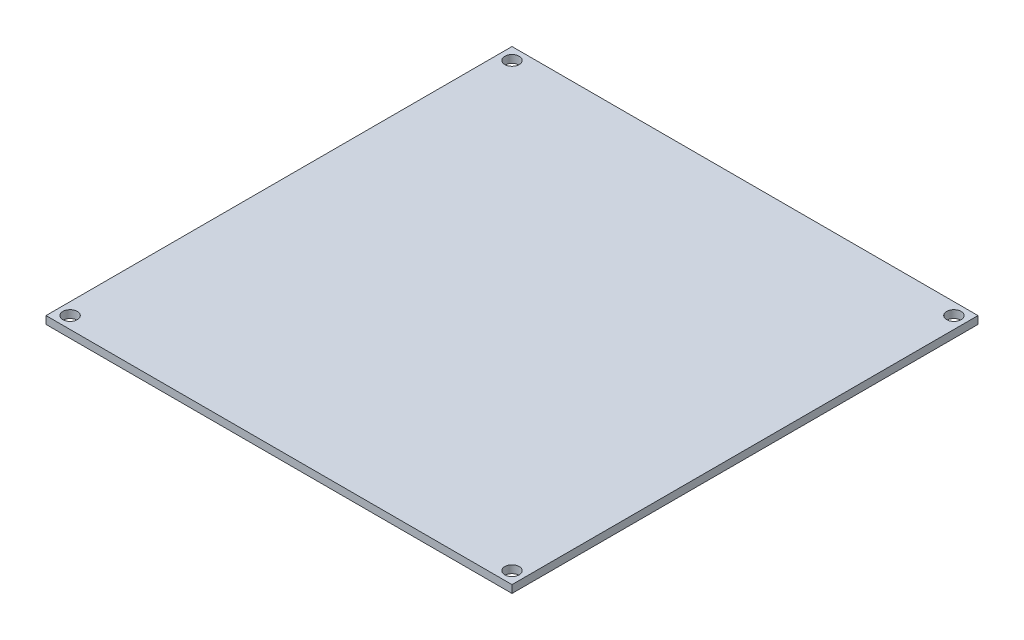
ISO-10303-21;
HEADER;
FILE_DESCRIPTION(('STEP AP214'),'2;1');
FILE_NAME('part.step','',(''),(''),'','','');
FILE_SCHEMA(('AUTOMOTIVE_DESIGN { 1 0 10303 214 1 1 1 1 }'));
ENDSEC;
DATA;
#1=APPLICATION_CONTEXT('core data for automotive mechanical design processes');
#2=APPLICATION_PROTOCOL_DEFINITION('international standard','automotive_design',2000,#1);
#3=PRODUCT_CONTEXT('',#1,'mechanical');
#4=PRODUCT('Part','Part','',(#3));
#5=PRODUCT_RELATED_PRODUCT_CATEGORY('part','',(#4));
#6=PRODUCT_DEFINITION_FORMATION('','',#4);
#7=PRODUCT_DEFINITION_CONTEXT('part definition',#1,'design');
#8=PRODUCT_DEFINITION('design','',#6,#7);
#9=PRODUCT_DEFINITION_SHAPE('','',#8);
#10=(LENGTH_UNIT() NAMED_UNIT(*) SI_UNIT(.MILLI.,.METRE.));
#11=(NAMED_UNIT(*) PLANE_ANGLE_UNIT() SI_UNIT($,.RADIAN.));
#12=(NAMED_UNIT(*) SI_UNIT($,.STERADIAN.) SOLID_ANGLE_UNIT());
#13=UNCERTAINTY_MEASURE_WITH_UNIT(LENGTH_MEASURE(1.E-05),#10,'distance_accuracy_value','');
#14=(GEOMETRIC_REPRESENTATION_CONTEXT(3) GLOBAL_UNCERTAINTY_ASSIGNED_CONTEXT((#13)) GLOBAL_UNIT_ASSIGNED_CONTEXT((#10,
#11,#12)) REPRESENTATION_CONTEXT('',''));
#15=CARTESIAN_POINT('',(0.,0.,0.));
#16=DIRECTION('',(0.,0.,1.));
#17=DIRECTION('',(1.,0.,0.));
#18=AXIS2_PLACEMENT_3D('',#15,#16,#17);
#19=CARTESIAN_POINT('',(0.,1.6,0.));
#20=DIRECTION('',(0.,-1.,0.));
#21=DIRECTION('',(0.,0.,-1.));
#22=AXIS2_PLACEMENT_3D('',#19,#20,#21);
#23=PLANE('',#22);
#24=DIRECTION('',(0.,0.,-1.));
#25=VECTOR('',#24,1.);
#26=CARTESIAN_POINT('',(48.4,1.6,48.4));
#27=LINE('',#26,#25);
#28=CARTESIAN_POINT('',(48.4,1.6,48.4));
#29=VERTEX_POINT('',#28);
#30=CARTESIAN_POINT('',(48.4,1.6,-48.4));
#31=VERTEX_POINT('',#30);
#32=EDGE_CURVE('E87',#29,#31,#27,.T.);
#33=ORIENTED_EDGE('',*,*,#32,.T.);
#34=DIRECTION('',(-1.,0.,0.));
#35=VECTOR('',#34,1.);
#36=CARTESIAN_POINT('',(-48.4,1.6,-48.4));
#37=LINE('',#36,#35);
#38=CARTESIAN_POINT('',(-48.4,1.6,-48.4));
#39=VERTEX_POINT('',#38);
#40=EDGE_CURVE('E82',#31,#39,#37,.T.);
#41=ORIENTED_EDGE('',*,*,#40,.T.);
#42=DIRECTION('',(0.,0.,1.));
#43=VECTOR('',#42,1.);
#44=CARTESIAN_POINT('',(-48.4,1.6,48.4));
#45=LINE('',#44,#43);
#46=CARTESIAN_POINT('',(-48.4,1.6,48.4));
#47=VERTEX_POINT('',#46);
#48=EDGE_CURVE('E85',#39,#47,#45,.T.);
#49=ORIENTED_EDGE('',*,*,#48,.T.);
#50=DIRECTION('',(1.,0.,0.));
#51=VECTOR('',#50,1.);
#52=CARTESIAN_POINT('',(-48.4,1.6,48.4));
#53=LINE('',#52,#51);
#54=EDGE_CURVE('E52',#47,#29,#53,.T.);
#55=ORIENTED_EDGE('',*,*,#54,.T.);
#56=EDGE_LOOP('',(#33,#41,#49,#55));
#57=FACE_BOUND('',#56,.T.);
#58=CARTESIAN_POINT('',(-45.9,1.6,-45.9));
#59=DIRECTION('',(0.,1.,0.));
#60=DIRECTION('',(0.,0.,1.));
#61=AXIS2_PLACEMENT_3D('',#58,#59,#60);
#62=CIRCLE('',#61,1.5);
#63=CARTESIAN_POINT('',(-45.9,1.6,-44.4));
#64=VERTEX_POINT('',#63);
#65=EDGE_CURVE('E102',#64,#64,#62,.T.);
#66=ORIENTED_EDGE('',*,*,#65,.F.);
#67=EDGE_LOOP('',(#66));
#68=FACE_BOUND('',#67,.T.);
#69=CARTESIAN_POINT('',(-45.9,1.6,45.9));
#70=DIRECTION('',(0.,1.,0.));
#71=DIRECTION('',(0.,0.,-1.));
#72=AXIS2_PLACEMENT_3D('',#69,#70,#71);
#73=CIRCLE('',#72,1.5);
#74=CARTESIAN_POINT('',(-45.9,1.6,44.4));
#75=VERTEX_POINT('',#74);
#76=EDGE_CURVE('E117',#75,#75,#73,.T.);
#77=ORIENTED_EDGE('',*,*,#76,.F.);
#78=EDGE_LOOP('',(#77));
#79=FACE_BOUND('',#78,.T.);
#80=CARTESIAN_POINT('',(45.9,1.6,45.9));
#81=DIRECTION('',(0.,1.,0.));
#82=DIRECTION('',(0.,0.,1.));
#83=AXIS2_PLACEMENT_3D('',#80,#81,#82);
#84=CIRCLE('',#83,1.5);
#85=CARTESIAN_POINT('',(45.9,1.6,47.4));
#86=VERTEX_POINT('',#85);
#87=EDGE_CURVE('E123',#86,#86,#84,.T.);
#88=ORIENTED_EDGE('',*,*,#87,.F.);
#89=EDGE_LOOP('',(#88));
#90=FACE_BOUND('',#89,.T.);
#91=CARTESIAN_POINT('',(45.9,1.6,-45.9));
#92=DIRECTION('',(0.,1.,0.));
#93=DIRECTION('',(0.,0.,-1.));
#94=AXIS2_PLACEMENT_3D('',#91,#92,#93);
#95=CIRCLE('',#94,1.5);
#96=CARTESIAN_POINT('',(45.9,1.6,-47.4));
#97=VERTEX_POINT('',#96);
#98=EDGE_CURVE('E129',#97,#97,#95,.T.);
#99=ORIENTED_EDGE('',*,*,#98,.F.);
#100=EDGE_LOOP('',(#99));
#101=FACE_BOUND('',#100,.T.);
#102=ADVANCED_FACE('F35',(#57,#68,#79,#90,#101),#23,.F.);
#103=CARTESIAN_POINT('',(0.,0.,0.));
#104=DIRECTION('',(0.,-1.,0.));
#105=DIRECTION('',(0.,0.,-1.));
#106=AXIS2_PLACEMENT_3D('',#103,#104,#105);
#107=PLANE('',#106);
#108=CARTESIAN_POINT('',(45.9,0.,45.9));
#109=DIRECTION('',(0.,1.,0.));
#110=DIRECTION('',(0.,0.,1.));
#111=AXIS2_PLACEMENT_3D('',#108,#109,#110);
#112=CIRCLE('',#111,1.5);
#113=CARTESIAN_POINT('',(45.9,0.,47.4));
#114=VERTEX_POINT('',#113);
#115=EDGE_CURVE('E126',#114,#114,#112,.T.);
#116=ORIENTED_EDGE('',*,*,#115,.T.);
#117=EDGE_LOOP('',(#116));
#118=FACE_BOUND('',#117,.T.);
#119=CARTESIAN_POINT('',(-45.9,0.,-45.9));
#120=DIRECTION('',(0.,1.,0.));
#121=DIRECTION('',(0.,0.,1.));
#122=AXIS2_PLACEMENT_3D('',#119,#120,#121);
#123=CIRCLE('',#122,1.5);
#124=CARTESIAN_POINT('',(-45.9,0.,-44.4));
#125=VERTEX_POINT('',#124);
#126=EDGE_CURVE('E114',#125,#125,#123,.T.);
#127=ORIENTED_EDGE('',*,*,#126,.T.);
#128=EDGE_LOOP('',(#127));
#129=FACE_BOUND('',#128,.T.);
#130=DIRECTION('',(0.,0.,-1.));
#131=VECTOR('',#130,1.);
#132=CARTESIAN_POINT('',(48.4,0.,48.4));
#133=LINE('',#132,#131);
#134=CARTESIAN_POINT('',(48.4,0.,48.4));
#135=VERTEX_POINT('',#134);
#136=CARTESIAN_POINT('',(48.4,0.,-48.4));
#137=VERTEX_POINT('',#136);
#138=EDGE_CURVE('E99',#135,#137,#133,.T.);
#139=ORIENTED_EDGE('',*,*,#138,.F.);
#140=DIRECTION('',(1.,0.,0.));
#141=VECTOR('',#140,1.);
#142=CARTESIAN_POINT('',(-48.4,0.,48.4));
#143=LINE('',#142,#141);
#144=CARTESIAN_POINT('',(-48.4,0.,48.4));
#145=VERTEX_POINT('',#144);
#146=EDGE_CURVE('E75',#145,#135,#143,.T.);
#147=ORIENTED_EDGE('',*,*,#146,.F.);
#148=DIRECTION('',(0.,0.,1.));
#149=VECTOR('',#148,1.);
#150=CARTESIAN_POINT('',(-48.4,0.,48.4));
#151=LINE('',#150,#149);
#152=CARTESIAN_POINT('',(-48.4,0.,-48.4));
#153=VERTEX_POINT('',#152);
#154=EDGE_CURVE('E69',#153,#145,#151,.T.);
#155=ORIENTED_EDGE('',*,*,#154,.F.);
#156=DIRECTION('',(-1.,0.,0.));
#157=VECTOR('',#156,1.);
#158=CARTESIAN_POINT('',(-48.4,0.,-48.4));
#159=LINE('',#158,#157);
#160=EDGE_CURVE('E91',#137,#153,#159,.T.);
#161=ORIENTED_EDGE('',*,*,#160,.F.);
#162=EDGE_LOOP('',(#139,#147,#155,#161));
#163=FACE_BOUND('',#162,.T.);
#164=CARTESIAN_POINT('',(-45.9,0.,45.9));
#165=DIRECTION('',(0.,1.,0.));
#166=DIRECTION('',(0.,0.,-1.));
#167=AXIS2_PLACEMENT_3D('',#164,#165,#166);
#168=CIRCLE('',#167,1.5);
#169=CARTESIAN_POINT('',(-45.9,0.,44.4));
#170=VERTEX_POINT('',#169);
#171=EDGE_CURVE('E120',#170,#170,#168,.T.);
#172=ORIENTED_EDGE('',*,*,#171,.T.);
#173=EDGE_LOOP('',(#172));
#174=FACE_BOUND('',#173,.T.);
#175=CARTESIAN_POINT('',(45.9,0.,-45.9));
#176=DIRECTION('',(0.,1.,0.));
#177=DIRECTION('',(0.,0.,-1.));
#178=AXIS2_PLACEMENT_3D('',#175,#176,#177);
#179=CIRCLE('',#178,1.5);
#180=CARTESIAN_POINT('',(45.9,0.,-47.4));
#181=VERTEX_POINT('',#180);
#182=EDGE_CURVE('E132',#181,#181,#179,.T.);
#183=ORIENTED_EDGE('',*,*,#182,.T.);
#184=EDGE_LOOP('',(#183));
#185=FACE_BOUND('',#184,.T.);
#186=ADVANCED_FACE('F110',(#118,#129,#163,#174,#185),#107,.T.);
#187=CARTESIAN_POINT('',(48.4,1.6,48.4));
#188=DIRECTION('',(-1.,0.,0.));
#189=DIRECTION('',(0.,0.,1.));
#190=AXIS2_PLACEMENT_3D('',#187,#188,#189);
#191=PLANE('',#190);
#192=ORIENTED_EDGE('',*,*,#138,.T.);
#193=DIRECTION('',(0.,-1.,0.));
#194=VECTOR('',#193,1.);
#195=CARTESIAN_POINT('',(48.4,1.6,-48.4));
#196=LINE('',#195,#194);
#197=EDGE_CURVE('E11',#31,#137,#196,.T.);
#198=ORIENTED_EDGE('',*,*,#197,.F.);
#199=ORIENTED_EDGE('',*,*,#32,.F.);
#200=DIRECTION('',(0.,-1.,0.));
#201=VECTOR('',#200,1.);
#202=CARTESIAN_POINT('',(48.4,1.6,48.4));
#203=LINE('',#202,#201);
#204=EDGE_CURVE('E95',#29,#135,#203,.T.);
#205=ORIENTED_EDGE('',*,*,#204,.T.);
#206=EDGE_LOOP('',(#192,#198,#199,#205));
#207=FACE_BOUND('',#206,.T.);
#208=ADVANCED_FACE('F37',(#207),#191,.F.);
#209=CARTESIAN_POINT('',(-48.4,1.6,-48.4));
#210=DIRECTION('',(0.,0.,1.));
#211=DIRECTION('',(1.,0.,0.));
#212=AXIS2_PLACEMENT_3D('',#209,#210,#211);
#213=PLANE('',#212);
#214=ORIENTED_EDGE('',*,*,#160,.T.);
#215=DIRECTION('',(0.,-1.,0.));
#216=VECTOR('',#215,1.);
#217=CARTESIAN_POINT('',(-48.4,1.6,-48.4));
#218=LINE('',#217,#216);
#219=EDGE_CURVE('E44',#39,#153,#218,.T.);
#220=ORIENTED_EDGE('',*,*,#219,.F.);
#221=ORIENTED_EDGE('',*,*,#40,.F.);
#222=ORIENTED_EDGE('',*,*,#197,.T.);
#223=EDGE_LOOP('',(#214,#220,#221,#222));
#224=FACE_BOUND('',#223,.T.);
#225=ADVANCED_FACE('F90',(#224),#213,.F.);
#226=CARTESIAN_POINT('',(-48.4,1.6,48.4));
#227=DIRECTION('',(1.,0.,0.));
#228=DIRECTION('',(0.,0.,-1.));
#229=AXIS2_PLACEMENT_3D('',#226,#227,#228);
#230=PLANE('',#229);
#231=ORIENTED_EDGE('',*,*,#154,.T.);
#232=DIRECTION('',(0.,-1.,0.));
#233=VECTOR('',#232,1.);
#234=CARTESIAN_POINT('',(-48.4,1.6,48.4));
#235=LINE('',#234,#233);
#236=EDGE_CURVE('E92',#47,#145,#235,.T.);
#237=ORIENTED_EDGE('',*,*,#236,.F.);
#238=ORIENTED_EDGE('',*,*,#48,.F.);
#239=ORIENTED_EDGE('',*,*,#219,.T.);
#240=EDGE_LOOP('',(#231,#237,#238,#239));
#241=FACE_BOUND('',#240,.T.);
#242=ADVANCED_FACE('F93',(#241),#230,.F.);
#243=CARTESIAN_POINT('',(-48.4,1.6,48.4));
#244=DIRECTION('',(0.,0.,-1.));
#245=DIRECTION('',(-1.,0.,0.));
#246=AXIS2_PLACEMENT_3D('',#243,#244,#245);
#247=PLANE('',#246);
#248=ORIENTED_EDGE('',*,*,#146,.T.);
#249=ORIENTED_EDGE('',*,*,#204,.F.);
#250=ORIENTED_EDGE('',*,*,#54,.F.);
#251=ORIENTED_EDGE('',*,*,#236,.T.);
#252=EDGE_LOOP('',(#248,#249,#250,#251));
#253=FACE_BOUND('',#252,.T.);
#254=ADVANCED_FACE('F107',(#253),#247,.F.);
#255=CARTESIAN_POINT('',(-45.9,1.6,-45.9));
#256=DIRECTION('',(0.,-1.,0.));
#257=DIRECTION('',(0.,0.,-1.));
#258=AXIS2_PLACEMENT_3D('',#255,#256,#257);
#259=CYLINDRICAL_SURFACE('',#258,1.5);
#260=ORIENTED_EDGE('',*,*,#65,.T.);
#261=EDGE_LOOP('',(#260));
#262=FACE_BOUND('',#261,.T.);
#263=ORIENTED_EDGE('',*,*,#126,.F.);
#264=EDGE_LOOP('',(#263));
#265=FACE_BOUND('',#264,.T.);
#266=ADVANCED_FACE('F149',(#262,#265),#259,.F.);
#267=CARTESIAN_POINT('',(-45.9,1.6,45.9));
#268=DIRECTION('',(0.,-1.,0.));
#269=DIRECTION('',(0.,0.,-1.));
#270=AXIS2_PLACEMENT_3D('',#267,#268,#269);
#271=CYLINDRICAL_SURFACE('',#270,1.5);
#272=ORIENTED_EDGE('',*,*,#76,.T.);
#273=EDGE_LOOP('',(#272));
#274=FACE_BOUND('',#273,.T.);
#275=ORIENTED_EDGE('',*,*,#171,.F.);
#276=EDGE_LOOP('',(#275));
#277=FACE_BOUND('',#276,.T.);
#278=ADVANCED_FACE('F195',(#274,#277),#271,.F.);
#279=CARTESIAN_POINT('',(45.9,1.6,45.9));
#280=DIRECTION('',(0.,-1.,0.));
#281=DIRECTION('',(0.,0.,-1.));
#282=AXIS2_PLACEMENT_3D('',#279,#280,#281);
#283=CYLINDRICAL_SURFACE('',#282,1.5);
#284=ORIENTED_EDGE('',*,*,#87,.T.);
#285=EDGE_LOOP('',(#284));
#286=FACE_BOUND('',#285,.T.);
#287=ORIENTED_EDGE('',*,*,#115,.F.);
#288=EDGE_LOOP('',(#287));
#289=FACE_BOUND('',#288,.T.);
#290=ADVANCED_FACE('F203',(#286,#289),#283,.F.);
#291=CARTESIAN_POINT('',(45.9,1.6,-45.9));
#292=DIRECTION('',(0.,-1.,0.));
#293=DIRECTION('',(0.,0.,-1.));
#294=AXIS2_PLACEMENT_3D('',#291,#292,#293);
#295=CYLINDRICAL_SURFACE('',#294,1.5);
#296=ORIENTED_EDGE('',*,*,#98,.T.);
#297=EDGE_LOOP('',(#296));
#298=FACE_BOUND('',#297,.T.);
#299=ORIENTED_EDGE('',*,*,#182,.F.);
#300=EDGE_LOOP('',(#299));
#301=FACE_BOUND('',#300,.T.);
#302=ADVANCED_FACE('F138',(#298,#301),#295,.F.);
#303=CLOSED_SHELL('',(#102,#186,#208,#225,#242,#254,#266,#278,#290,#302));
#304=MANIFOLD_SOLID_BREP('B2',#303);
#305=ADVANCED_BREP_SHAPE_REPRESENTATION('',(#18,#304),#14);
#306=SHAPE_DEFINITION_REPRESENTATION(#9,#305);
ENDSEC;
END-ISO-10303-21;
